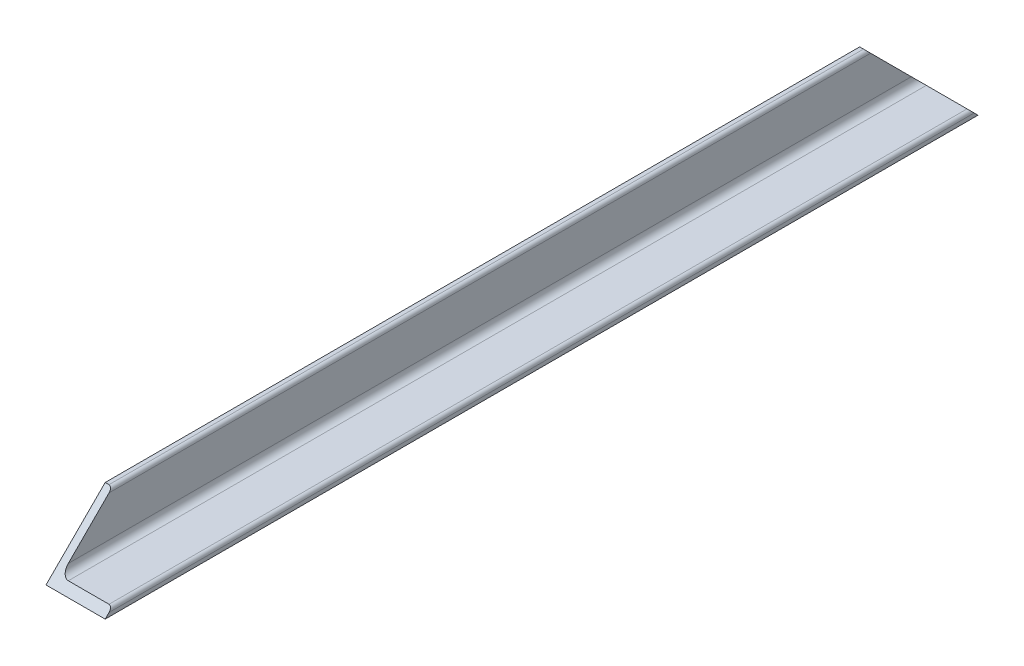
ISO-10303-21;
HEADER;
FILE_DESCRIPTION(('STEP AP214'),'2;1');
FILE_NAME('part.step','',(''),(''),'','','');
FILE_SCHEMA(('AUTOMOTIVE_DESIGN { 1 0 10303 214 1 1 1 1 }'));
ENDSEC;
DATA;
#1=APPLICATION_CONTEXT('core data for automotive mechanical design processes');
#2=APPLICATION_PROTOCOL_DEFINITION('international standard','automotive_design',2000,#1);
#3=PRODUCT_CONTEXT('',#1,'mechanical');
#4=PRODUCT('Part','Part','',(#3));
#5=PRODUCT_RELATED_PRODUCT_CATEGORY('part','',(#4));
#6=PRODUCT_DEFINITION_FORMATION('','',#4);
#7=PRODUCT_DEFINITION_CONTEXT('part definition',#1,'design');
#8=PRODUCT_DEFINITION('design','',#6,#7);
#9=PRODUCT_DEFINITION_SHAPE('','',#8);
#10=(LENGTH_UNIT() NAMED_UNIT(*) SI_UNIT(.MILLI.,.METRE.));
#11=(NAMED_UNIT(*) PLANE_ANGLE_UNIT() SI_UNIT($,.RADIAN.));
#12=(NAMED_UNIT(*) SI_UNIT($,.STERADIAN.) SOLID_ANGLE_UNIT());
#13=UNCERTAINTY_MEASURE_WITH_UNIT(LENGTH_MEASURE(1.E-05),#10,'distance_accuracy_value','');
#14=(GEOMETRIC_REPRESENTATION_CONTEXT(3) GLOBAL_UNCERTAINTY_ASSIGNED_CONTEXT((#13)) GLOBAL_UNIT_ASSIGNED_CONTEXT((#10,
#11,#12)) REPRESENTATION_CONTEXT('',''));
#15=CARTESIAN_POINT('',(0.,0.,0.));
#16=DIRECTION('',(0.,0.,1.));
#17=DIRECTION('',(1.,0.,0.));
#18=AXIS2_PLACEMENT_3D('',#15,#16,#17);
#19=CARTESIAN_POINT('',(0.,280.98749995,280.98749995));
#20=DIRECTION('',(0.,-0.707106781186548,-0.707106781186547));
#21=DIRECTION('',(0.,0.707106781186547,-0.707106781186548));
#22=AXIS2_PLACEMENT_3D('',#19,#20,#21);
#23=PLANE('',#22);
#24=DIRECTION('',(0.,-0.707106781186545,0.70710678118655));
#25=VECTOR('',#24,1.);
#26=CARTESIAN_POINT('',(38.1,2.47649999999999,559.4984999));
#27=LINE('',#26,#25);
#28=CARTESIAN_POINT('',(38.1,2.47650000000003,559.4984999));
#29=VERTEX_POINT('',#28);
#30=CARTESIAN_POINT('',(38.1,-1.2299594953636E-08,561.97499996663));
#31=VERTEX_POINT('',#30);
#32=EDGE_CURVE('E35',#29,#31,#27,.T.);
#33=ORIENTED_EDGE('',*,*,#32,.F.);
#34=CARTESIAN_POINT('',(35.814,2.47650000000003,559.4984999));
#35=DIRECTION('',(0.,-0.707106781186548,-0.707106781186547));
#36=DIRECTION('',(0.,-0.707106781186547,0.707106781186548));
#37=AXIS2_PLACEMENT_3D('',#34,#35,#36);
#38=ELLIPSE('',#37,3.23289220358491,2.286);
#39=CARTESIAN_POINT('',(35.814,4.7625,557.2124999));
#40=VERTEX_POINT('',#39);
#41=EDGE_CURVE('E134',#40,#29,#38,.T.);
#42=ORIENTED_EDGE('',*,*,#41,.F.);
#43=DIRECTION('',(1.,0.,0.));
#44=VECTOR('',#43,1.);
#45=CARTESIAN_POINT('',(9.5885,4.76249999999998,557.2124999));
#46=LINE('',#45,#44);
#47=CARTESIAN_POINT('',(9.5885,4.7625,557.2124999));
#48=VERTEX_POINT('',#47);
#49=EDGE_CURVE('E126',#48,#40,#46,.T.);
#50=ORIENTED_EDGE('',*,*,#49,.F.);
#51=CARTESIAN_POINT('',(9.5885,9.5885,552.3864999));
#52=DIRECTION('',(0.,0.707106781186548,0.707106781186548));
#53=DIRECTION('',(0.,-0.707106781186548,0.707106781186548));
#54=AXIS2_PLACEMENT_3D('',#51,#52,#53);
#55=ELLIPSE('',#54,6.82499465201256,4.826);
#56=CARTESIAN_POINT('',(4.7625,9.5885,552.3864999));
#57=VERTEX_POINT('',#56);
#58=EDGE_CURVE('E129',#57,#48,#55,.T.);
#59=ORIENTED_EDGE('',*,*,#58,.F.);
#60=DIRECTION('',(0.,-0.707106781186547,0.707106781186548));
#61=VECTOR('',#60,1.);
#62=CARTESIAN_POINT('',(4.7625,35.814,526.1609999));
#63=LINE('',#62,#61);
#64=CARTESIAN_POINT('',(4.7625,35.814,526.1609999));
#65=VERTEX_POINT('',#64);
#66=EDGE_CURVE('E10',#65,#57,#63,.T.);
#67=ORIENTED_EDGE('',*,*,#66,.F.);
#68=CARTESIAN_POINT('',(2.4765,35.814,526.1609999));
#69=DIRECTION('',(0.,-0.707106781186548,-0.707106781186548));
#70=DIRECTION('',(0.,-0.707106781186548,0.707106781186548));
#71=AXIS2_PLACEMENT_3D('',#68,#69,#70);
#72=ELLIPSE('',#71,3.23289220358491,2.286);
#73=CARTESIAN_POINT('',(2.4765,38.1,523.8749999));
#74=VERTEX_POINT('',#73);
#75=EDGE_CURVE('E97',#74,#65,#72,.T.);
#76=ORIENTED_EDGE('',*,*,#75,.F.);
#77=DIRECTION('',(1.,0.,0.));
#78=VECTOR('',#77,1.);
#79=CARTESIAN_POINT('',(0.,38.1,523.8749999));
#80=LINE('',#79,#78);
#81=CARTESIAN_POINT('',(0.,38.1,523.8749999));
#82=VERTEX_POINT('',#81);
#83=EDGE_CURVE('E104',#82,#74,#80,.T.);
#84=ORIENTED_EDGE('',*,*,#83,.F.);
#85=DIRECTION('',(0.,0.707106781186547,-0.707106781186548));
#86=VECTOR('',#85,1.);
#87=CARTESIAN_POINT('',(0.,-5.00002154936656E-08,561.97499995));
#88=LINE('',#87,#86);
#89=CARTESIAN_POINT('',(0.,-1.22996054448191E-08,561.97499996663));
#90=VERTEX_POINT('',#89);
#91=EDGE_CURVE('E117',#90,#82,#88,.T.);
#92=ORIENTED_EDGE('',*,*,#91,.F.);
#93=DIRECTION('',(-1.,0.,0.));
#94=VECTOR('',#93,1.);
#95=CARTESIAN_POINT('',(38.1,0.,561.975));
#96=LINE('',#95,#94);
#97=EDGE_CURVE('E114',#31,#90,#96,.T.);
#98=ORIENTED_EDGE('',*,*,#97,.F.);
#99=EDGE_LOOP('',(#33,#42,#50,#59,#67,#76,#84,#92,#98));
#100=FACE_BOUND('',#99,.T.);
#101=ADVANCED_FACE('F16',(#100),#23,.F.);
#102=CARTESIAN_POINT('',(4.7625,35.814,0.));
#103=DIRECTION('',(1.,0.,0.));
#104=DIRECTION('',(0.,0.,-1.));
#105=AXIS2_PLACEMENT_3D('',#102,#103,#104);
#106=PLANE('',#105);
#107=ORIENTED_EDGE('',*,*,#66,.T.);
#108=DIRECTION('',(0.,0.,1.));
#109=VECTOR('',#108,1.);
#110=CARTESIAN_POINT('',(4.7625,9.5885,9.5885001));
#111=LINE('',#110,#109);
#112=CARTESIAN_POINT('',(4.7625,9.5885,9.5885001));
#113=VERTEX_POINT('',#112);
#114=EDGE_CURVE('E122',#113,#57,#111,.T.);
#115=ORIENTED_EDGE('',*,*,#114,.F.);
#116=DIRECTION('',(0.,0.707106781186547,0.707106781186548));
#117=VECTOR('',#116,1.);
#118=CARTESIAN_POINT('',(4.7625,9.58849999999999,9.58850010000002));
#119=LINE('',#118,#117);
#120=CARTESIAN_POINT('',(4.7625,35.814,35.8140001));
#121=VERTEX_POINT('',#120);
#122=EDGE_CURVE('E26',#113,#121,#119,.T.);
#123=ORIENTED_EDGE('',*,*,#122,.T.);
#124=DIRECTION('',(0.,0.,1.));
#125=VECTOR('',#124,1.);
#126=CARTESIAN_POINT('',(4.7625,35.814,35.8140001));
#127=LINE('',#126,#125);
#128=EDGE_CURVE('E93',#121,#65,#127,.T.);
#129=ORIENTED_EDGE('',*,*,#128,.T.);
#130=EDGE_LOOP('',(#107,#115,#123,#129));
#131=FACE_BOUND('',#130,.T.);
#132=ADVANCED_FACE('F189',(#131),#106,.T.);
#133=CARTESIAN_POINT('',(9.5885,9.5885,0.));
#134=DIRECTION('',(0.,0.,1.));
#135=DIRECTION('',(1.,0.,0.));
#136=AXIS2_PLACEMENT_3D('',#133,#134,#135);
#137=CYLINDRICAL_SURFACE('',#136,4.826);
#138=ORIENTED_EDGE('',*,*,#58,.T.);
#139=DIRECTION('',(0.,0.,1.));
#140=VECTOR('',#139,1.);
#141=CARTESIAN_POINT('',(9.5885,4.7625,4.7625001));
#142=LINE('',#141,#140);
#143=CARTESIAN_POINT('',(9.5885,4.7625,4.7625001));
#144=VERTEX_POINT('',#143);
#145=EDGE_CURVE('E130',#144,#48,#142,.T.);
#146=ORIENTED_EDGE('',*,*,#145,.F.);
#147=CARTESIAN_POINT('',(9.5885,9.5885,9.5885001));
#148=DIRECTION('',(0.,0.707106781186548,-0.707106781186548));
#149=DIRECTION('',(0.,-0.707106781186548,-0.707106781186548));
#150=AXIS2_PLACEMENT_3D('',#147,#148,#149);
#151=ELLIPSE('',#150,6.82499465201256,4.826);
#152=EDGE_CURVE('E125',#144,#113,#151,.T.);
#153=ORIENTED_EDGE('',*,*,#152,.T.);
#154=ORIENTED_EDGE('',*,*,#114,.T.);
#155=EDGE_LOOP('',(#138,#146,#153,#154));
#156=FACE_BOUND('',#155,.T.);
#157=ADVANCED_FACE('F166',(#156),#137,.F.);
#158=CARTESIAN_POINT('',(9.5885,4.7625,0.));
#159=DIRECTION('',(0.,1.,0.));
#160=DIRECTION('',(0.,0.,1.));
#161=AXIS2_PLACEMENT_3D('',#158,#159,#160);
#162=PLANE('',#161);
#163=ORIENTED_EDGE('',*,*,#49,.T.);
#164=DIRECTION('',(0.,0.,1.));
#165=VECTOR('',#164,1.);
#166=CARTESIAN_POINT('',(35.814,4.7625,4.76250010000003));
#167=LINE('',#166,#165);
#168=CARTESIAN_POINT('',(35.814,4.7625,4.76250010000003));
#169=VERTEX_POINT('',#168);
#170=EDGE_CURVE('E137',#169,#40,#167,.T.);
#171=ORIENTED_EDGE('',*,*,#170,.F.);
#172=DIRECTION('',(-1.,0.,0.));
#173=VECTOR('',#172,1.);
#174=CARTESIAN_POINT('',(35.814,4.7625,4.76250010000003));
#175=LINE('',#174,#173);
#176=EDGE_CURVE('E133',#169,#144,#175,.T.);
#177=ORIENTED_EDGE('',*,*,#176,.T.);
#178=ORIENTED_EDGE('',*,*,#145,.T.);
#179=EDGE_LOOP('',(#163,#171,#177,#178));
#180=FACE_BOUND('',#179,.T.);
#181=ADVANCED_FACE('F170',(#180),#162,.T.);
#182=CARTESIAN_POINT('',(35.814,2.47650000000003,0.));
#183=DIRECTION('',(0.,0.,1.));
#184=DIRECTION('',(1.,0.,0.));
#185=AXIS2_PLACEMENT_3D('',#182,#183,#184);
#186=CYLINDRICAL_SURFACE('',#185,2.286);
#187=ORIENTED_EDGE('',*,*,#41,.T.);
#188=DIRECTION('',(0.,0.,1.));
#189=VECTOR('',#188,1.);
#190=CARTESIAN_POINT('',(38.1,2.47650000000003,2.47650010000003));
#191=LINE('',#190,#189);
#192=CARTESIAN_POINT('',(38.1,2.47650000000003,2.47650010000003));
#193=VERTEX_POINT('',#192);
#194=EDGE_CURVE('E121',#193,#29,#191,.T.);
#195=ORIENTED_EDGE('',*,*,#194,.F.);
#196=CARTESIAN_POINT('',(35.814,2.47650000000003,2.47650010000003));
#197=DIRECTION('',(0.,-0.707106781186548,0.707106781186547));
#198=DIRECTION('',(0.,-0.707106781186547,-0.707106781186548));
#199=AXIS2_PLACEMENT_3D('',#196,#197,#198);
#200=ELLIPSE('',#199,3.23289220358491,2.286);
#201=EDGE_CURVE('E140',#193,#169,#200,.T.);
#202=ORIENTED_EDGE('',*,*,#201,.T.);
#203=ORIENTED_EDGE('',*,*,#170,.T.);
#204=EDGE_LOOP('',(#187,#195,#202,#203));
#205=FACE_BOUND('',#204,.T.);
#206=ADVANCED_FACE('F173',(#205),#186,.T.);
#207=CARTESIAN_POINT('',(0.,-5.00000016E-08,5.00000016E-08));
#208=DIRECTION('',(0.,-0.707106781186548,0.707106781186547));
#209=DIRECTION('',(0.,-0.707106781186547,-0.707106781186548));
#210=AXIS2_PLACEMENT_3D('',#207,#208,#209);
#211=PLANE('',#210);
#212=ORIENTED_EDGE('',*,*,#176,.F.);
#213=ORIENTED_EDGE('',*,*,#201,.F.);
#214=DIRECTION('',(0.,0.707106781186547,0.707106781186548));
#215=VECTOR('',#214,1.);
#216=CARTESIAN_POINT('',(38.1,-4.99999971591085E-08,5.00000060408915E-08));
#217=LINE('',#216,#215);
#218=CARTESIAN_POINT('',(38.1,-1.22995590942721E-08,3.33697736714916E-08));
#219=VERTEX_POINT('',#218);
#220=EDGE_CURVE('E145',#219,#193,#217,.T.);
#221=ORIENTED_EDGE('',*,*,#220,.F.);
#222=DIRECTION('',(-1.,0.,0.));
#223=VECTOR('',#222,1.);
#224=CARTESIAN_POINT('',(38.1,0.,0.));
#225=LINE('',#224,#223);
#226=CARTESIAN_POINT('',(0.,-1.22995643299837E-08,3.33697685807904E-08));
#227=VERTEX_POINT('',#226);
#228=EDGE_CURVE('E119',#219,#227,#225,.T.);
#229=ORIENTED_EDGE('',*,*,#228,.T.);
#230=DIRECTION('',(0.,-0.707106781186548,-0.707106781186548));
#231=VECTOR('',#230,1.);
#232=CARTESIAN_POINT('',(0.,38.1,38.1000001));
#233=LINE('',#232,#231);
#234=CARTESIAN_POINT('',(0.,38.1,38.1000001));
#235=VERTEX_POINT('',#234);
#236=EDGE_CURVE('E102',#235,#227,#233,.T.);
#237=ORIENTED_EDGE('',*,*,#236,.F.);
#238=DIRECTION('',(-1.,0.,0.));
#239=VECTOR('',#238,1.);
#240=CARTESIAN_POINT('',(2.4765,38.1,38.1000001));
#241=LINE('',#240,#239);
#242=CARTESIAN_POINT('',(2.4765,38.1,38.1000001));
#243=VERTEX_POINT('',#242);
#244=EDGE_CURVE('E85',#243,#235,#241,.T.);
#245=ORIENTED_EDGE('',*,*,#244,.F.);
#246=CARTESIAN_POINT('',(2.4765,35.814,35.8140001));
#247=DIRECTION('',(0.,-0.707106781186548,0.707106781186547));
#248=DIRECTION('',(0.,-0.707106781186547,-0.707106781186548));
#249=AXIS2_PLACEMENT_3D('',#246,#247,#248);
#250=ELLIPSE('',#249,3.23289220358491,2.286);
#251=EDGE_CURVE('E91',#121,#243,#250,.T.);
#252=ORIENTED_EDGE('',*,*,#251,.F.);
#253=ORIENTED_EDGE('',*,*,#122,.F.);
#254=ORIENTED_EDGE('',*,*,#152,.F.);
#255=EDGE_LOOP('',(#212,#213,#221,#229,#237,#245,#252,#253,#254));
#256=FACE_BOUND('',#255,.T.);
#257=ADVANCED_FACE('F100',(#256),#211,.F.);
#258=CARTESIAN_POINT('',(0.,0.,0.));
#259=DIRECTION('',(-1.,0.,0.));
#260=DIRECTION('',(0.,0.,1.));
#261=AXIS2_PLACEMENT_3D('',#258,#259,#260);
#262=PLANE('',#261);
#263=ORIENTED_EDGE('',*,*,#91,.T.);
#264=DIRECTION('',(0.,0.,1.));
#265=VECTOR('',#264,1.);
#266=CARTESIAN_POINT('',(0.,38.1,38.1000001));
#267=LINE('',#266,#265);
#268=EDGE_CURVE('E105',#235,#82,#267,.T.);
#269=ORIENTED_EDGE('',*,*,#268,.F.);
#270=ORIENTED_EDGE('',*,*,#236,.T.);
#271=DIRECTION('',(0.,0.,1.));
#272=VECTOR('',#271,1.);
#273=CARTESIAN_POINT('',(0.,0.,0.));
#274=LINE('',#273,#272);
#275=EDGE_CURVE('E151',#227,#90,#274,.T.);
#276=ORIENTED_EDGE('',*,*,#275,.T.);
#277=EDGE_LOOP('',(#263,#269,#270,#276));
#278=FACE_BOUND('',#277,.T.);
#279=ADVANCED_FACE('F178',(#278),#262,.T.);
#280=CARTESIAN_POINT('',(38.1,2.47650000000003,0.));
#281=DIRECTION('',(1.,0.,0.));
#282=DIRECTION('',(0.,0.,-1.));
#283=AXIS2_PLACEMENT_3D('',#280,#281,#282);
#284=PLANE('',#283);
#285=ORIENTED_EDGE('',*,*,#32,.T.);
#286=DIRECTION('',(0.,0.,1.));
#287=VECTOR('',#286,1.);
#288=CARTESIAN_POINT('',(38.1,0.,0.));
#289=LINE('',#288,#287);
#290=EDGE_CURVE('E111',#219,#31,#289,.T.);
#291=ORIENTED_EDGE('',*,*,#290,.F.);
#292=ORIENTED_EDGE('',*,*,#220,.T.);
#293=ORIENTED_EDGE('',*,*,#194,.T.);
#294=EDGE_LOOP('',(#285,#291,#292,#293));
#295=FACE_BOUND('',#294,.T.);
#296=ADVANCED_FACE('F174',(#295),#284,.T.);
#297=CARTESIAN_POINT('',(38.1,0.,0.));
#298=DIRECTION('',(0.,-1.,0.));
#299=DIRECTION('',(0.,0.,-1.));
#300=AXIS2_PLACEMENT_3D('',#297,#298,#299);
#301=PLANE('',#300);
#302=ORIENTED_EDGE('',*,*,#97,.T.);
#303=ORIENTED_EDGE('',*,*,#275,.F.);
#304=ORIENTED_EDGE('',*,*,#228,.F.);
#305=ORIENTED_EDGE('',*,*,#290,.T.);
#306=EDGE_LOOP('',(#302,#303,#304,#305));
#307=FACE_BOUND('',#306,.T.);
#308=ADVANCED_FACE('F177',(#307),#301,.T.);
#309=CARTESIAN_POINT('',(0.,38.1,0.));
#310=DIRECTION('',(0.,1.,0.));
#311=DIRECTION('',(0.,0.,1.));
#312=AXIS2_PLACEMENT_3D('',#309,#310,#311);
#313=PLANE('',#312);
#314=ORIENTED_EDGE('',*,*,#83,.T.);
#315=DIRECTION('',(0.,0.,1.));
#316=VECTOR('',#315,1.);
#317=CARTESIAN_POINT('',(2.4765,38.1,38.1000001));
#318=LINE('',#317,#316);
#319=EDGE_CURVE('E20',#243,#74,#318,.T.);
#320=ORIENTED_EDGE('',*,*,#319,.F.);
#321=ORIENTED_EDGE('',*,*,#244,.T.);
#322=ORIENTED_EDGE('',*,*,#268,.T.);
#323=EDGE_LOOP('',(#314,#320,#321,#322));
#324=FACE_BOUND('',#323,.T.);
#325=ADVANCED_FACE('F108',(#324),#313,.T.);
#326=CARTESIAN_POINT('',(2.4765,35.814,0.));
#327=DIRECTION('',(0.,0.,1.));
#328=DIRECTION('',(1.,0.,0.));
#329=AXIS2_PLACEMENT_3D('',#326,#327,#328);
#330=CYLINDRICAL_SURFACE('',#329,2.286);
#331=ORIENTED_EDGE('',*,*,#75,.T.);
#332=ORIENTED_EDGE('',*,*,#128,.F.);
#333=ORIENTED_EDGE('',*,*,#251,.T.);
#334=ORIENTED_EDGE('',*,*,#319,.T.);
#335=EDGE_LOOP('',(#331,#332,#333,#334));
#336=FACE_BOUND('',#335,.T.);
#337=ADVANCED_FACE('F18',(#336),#330,.T.);
#338=CLOSED_SHELL('',(#101,#132,#157,#181,#206,#257,#279,#296,#308,#325,#337));
#339=MANIFOLD_SOLID_BREP('B1',#338);
#340=ADVANCED_BREP_SHAPE_REPRESENTATION('',(#18,#339),#14);
#341=SHAPE_DEFINITION_REPRESENTATION(#9,#340);
ENDSEC;
END-ISO-10303-21;
